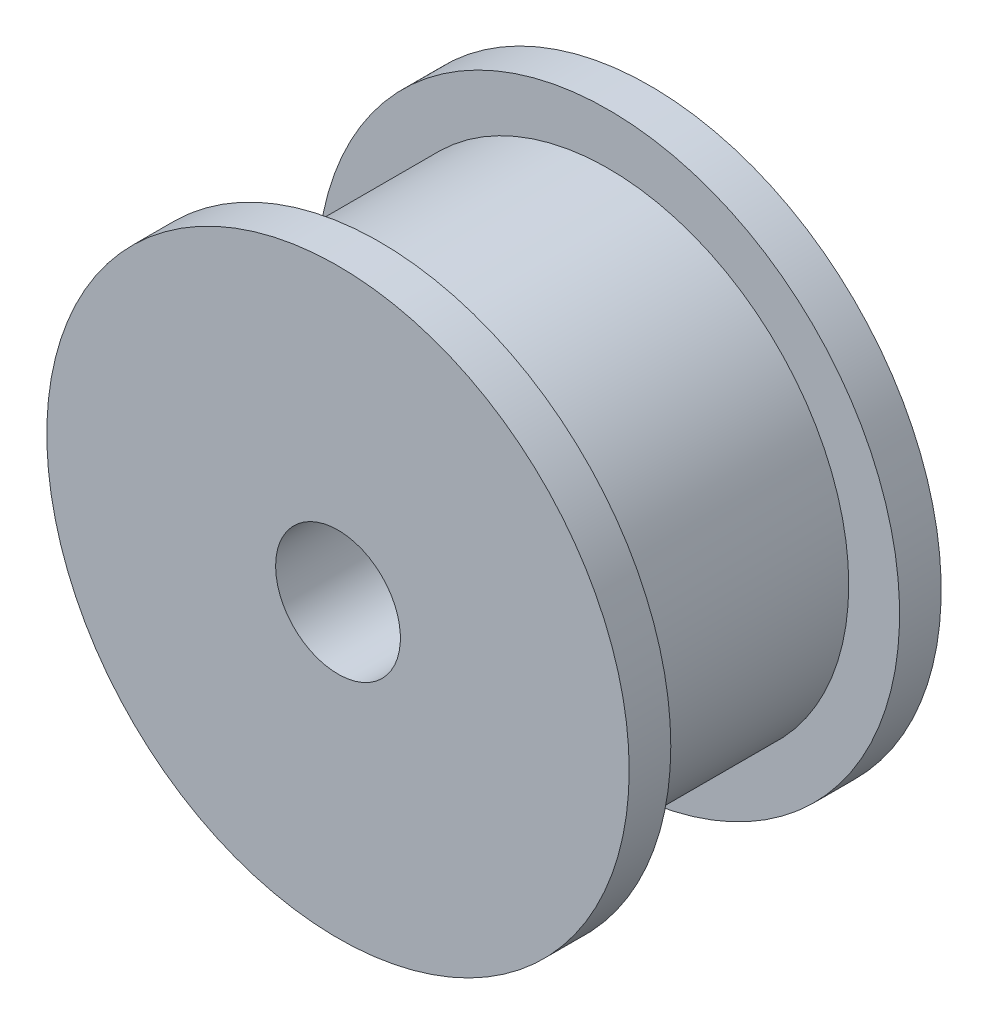
ISO-10303-21;
HEADER;
FILE_DESCRIPTION(('STEP AP214'),'2;1');
FILE_NAME('part.step','',(''),(''),'','','');
FILE_SCHEMA(('AUTOMOTIVE_DESIGN { 1 0 10303 214 1 1 1 1 }'));
ENDSEC;
DATA;
#1=APPLICATION_CONTEXT('core data for automotive mechanical design processes');
#2=APPLICATION_PROTOCOL_DEFINITION('international standard','automotive_design',2000,#1);
#3=PRODUCT_CONTEXT('',#1,'mechanical');
#4=PRODUCT('Part','Part','',(#3));
#5=PRODUCT_RELATED_PRODUCT_CATEGORY('part','',(#4));
#6=PRODUCT_DEFINITION_FORMATION('','',#4);
#7=PRODUCT_DEFINITION_CONTEXT('part definition',#1,'design');
#8=PRODUCT_DEFINITION('design','',#6,#7);
#9=PRODUCT_DEFINITION_SHAPE('','',#8);
#10=(LENGTH_UNIT() NAMED_UNIT(*) SI_UNIT(.MILLI.,.METRE.));
#11=(NAMED_UNIT(*) PLANE_ANGLE_UNIT() SI_UNIT($,.RADIAN.));
#12=(NAMED_UNIT(*) SI_UNIT($,.STERADIAN.) SOLID_ANGLE_UNIT());
#13=UNCERTAINTY_MEASURE_WITH_UNIT(LENGTH_MEASURE(1.E-05),#10,'distance_accuracy_value','');
#14=(GEOMETRIC_REPRESENTATION_CONTEXT(3) GLOBAL_UNCERTAINTY_ASSIGNED_CONTEXT((#13)) GLOBAL_UNIT_ASSIGNED_CONTEXT((#10,
#11,#12)) REPRESENTATION_CONTEXT('',''));
#15=CARTESIAN_POINT('',(0.,0.,0.));
#16=DIRECTION('',(0.,0.,1.));
#17=DIRECTION('',(1.,0.,0.));
#18=AXIS2_PLACEMENT_3D('',#15,#16,#17);
#19=CARTESIAN_POINT('',(0.,0.,11.));
#20=DIRECTION('',(0.,0.,-1.));
#21=DIRECTION('',(-1.,0.,0.));
#22=AXIS2_PLACEMENT_3D('',#19,#20,#21);
#23=CYLINDRICAL_SURFACE('',#22,11.555);
#24=CARTESIAN_POINT('',(0.,0.,11.));
#25=DIRECTION('',(0.,0.,1.));
#26=DIRECTION('',(1.,0.,0.));
#27=AXIS2_PLACEMENT_3D('',#24,#25,#26);
#28=CIRCLE('',#27,11.555);
#29=CARTESIAN_POINT('',(11.555,0.,11.));
#30=VERTEX_POINT('',#29);
#31=EDGE_CURVE('E10',#30,#30,#28,.T.);
#32=ORIENTED_EDGE('',*,*,#31,.F.);
#33=EDGE_LOOP('',(#32));
#34=FACE_BOUND('',#33,.T.);
#35=CARTESIAN_POINT('',(0.,0.,0.));
#36=DIRECTION('',(0.,0.,1.));
#37=DIRECTION('',(1.,0.,0.));
#38=AXIS2_PLACEMENT_3D('',#35,#36,#37);
#39=CIRCLE('',#38,11.555);
#40=CARTESIAN_POINT('',(11.555,0.,0.));
#41=VERTEX_POINT('',#40);
#42=EDGE_CURVE('E39',#41,#41,#39,.T.);
#43=ORIENTED_EDGE('',*,*,#42,.T.);
#44=EDGE_LOOP('',(#43));
#45=FACE_BOUND('',#44,.T.);
#46=ADVANCED_FACE('F36',(#34,#45),#23,.T.);
#47=CARTESIAN_POINT('',(0.,0.,13.));
#48=DIRECTION('',(0.,0.,-1.));
#49=DIRECTION('',(-1.,0.,0.));
#50=AXIS2_PLACEMENT_3D('',#47,#48,#49);
#51=CYLINDRICAL_SURFACE('',#50,14.);
#52=CARTESIAN_POINT('',(0.,0.,13.));
#53=DIRECTION('',(0.,0.,1.));
#54=DIRECTION('',(1.,0.,0.));
#55=AXIS2_PLACEMENT_3D('',#52,#53,#54);
#56=CIRCLE('',#55,14.);
#57=CARTESIAN_POINT('',(14.,0.,13.));
#58=VERTEX_POINT('',#57);
#59=EDGE_CURVE('E44',#58,#58,#56,.T.);
#60=ORIENTED_EDGE('',*,*,#59,.F.);
#61=EDGE_LOOP('',(#60));
#62=FACE_BOUND('',#61,.T.);
#63=CARTESIAN_POINT('',(0.,0.,11.));
#64=DIRECTION('',(0.,0.,1.));
#65=DIRECTION('',(1.,0.,0.));
#66=AXIS2_PLACEMENT_3D('',#63,#64,#65);
#67=CIRCLE('',#66,14.);
#68=CARTESIAN_POINT('',(14.,0.,11.));
#69=VERTEX_POINT('',#68);
#70=EDGE_CURVE('E50',#69,#69,#67,.T.);
#71=ORIENTED_EDGE('',*,*,#70,.T.);
#72=EDGE_LOOP('',(#71));
#73=FACE_BOUND('',#72,.T.);
#74=ADVANCED_FACE('F103',(#62,#73),#51,.T.);
#75=CARTESIAN_POINT('',(0.,0.,13.));
#76=DIRECTION('',(0.,0.,1.));
#77=DIRECTION('',(1.,0.,0.));
#78=AXIS2_PLACEMENT_3D('',#75,#76,#77);
#79=PLANE('',#78);
#80=CARTESIAN_POINT('',(0.,0.,13.));
#81=DIRECTION('',(0.,0.,-1.));
#82=DIRECTION('',(-1.,0.,0.));
#83=AXIS2_PLACEMENT_3D('',#80,#81,#82);
#84=CIRCLE('',#83,3.);
#85=CARTESIAN_POINT('',(-3.,0.,13.));
#86=VERTEX_POINT('',#85);
#87=EDGE_CURVE('E61',#86,#86,#84,.T.);
#88=ORIENTED_EDGE('',*,*,#87,.T.);
#89=EDGE_LOOP('',(#88));
#90=FACE_BOUND('',#89,.T.);
#91=ORIENTED_EDGE('',*,*,#59,.T.);
#92=EDGE_LOOP('',(#91));
#93=FACE_BOUND('',#92,.T.);
#94=ADVANCED_FACE('F73',(#90,#93),#79,.T.);
#95=CARTESIAN_POINT('',(0.,0.,11.));
#96=DIRECTION('',(0.,0.,1.));
#97=DIRECTION('',(1.,0.,0.));
#98=AXIS2_PLACEMENT_3D('',#95,#96,#97);
#99=PLANE('',#98);
#100=ORIENTED_EDGE('',*,*,#31,.T.);
#101=EDGE_LOOP('',(#100));
#102=FACE_BOUND('',#101,.T.);
#103=ORIENTED_EDGE('',*,*,#70,.F.);
#104=EDGE_LOOP('',(#103));
#105=FACE_BOUND('',#104,.T.);
#106=ADVANCED_FACE('F92',(#102,#105),#99,.F.);
#107=CARTESIAN_POINT('',(0.,0.,-2.));
#108=DIRECTION('',(0.,0.,1.));
#109=DIRECTION('',(1.,0.,0.));
#110=AXIS2_PLACEMENT_3D('',#107,#108,#109);
#111=CYLINDRICAL_SURFACE('',#110,14.);
#112=CARTESIAN_POINT('',(0.,0.,-2.));
#113=DIRECTION('',(0.,0.,-1.));
#114=DIRECTION('',(-1.,0.,0.));
#115=AXIS2_PLACEMENT_3D('',#112,#113,#114);
#116=CIRCLE('',#115,14.);
#117=CARTESIAN_POINT('',(-14.,0.,-2.));
#118=VERTEX_POINT('',#117);
#119=EDGE_CURVE('E60',#118,#118,#116,.T.);
#120=ORIENTED_EDGE('',*,*,#119,.F.);
#121=EDGE_LOOP('',(#120));
#122=FACE_BOUND('',#121,.T.);
#123=CARTESIAN_POINT('',(0.,0.,0.));
#124=DIRECTION('',(0.,0.,-1.));
#125=DIRECTION('',(-1.,0.,0.));
#126=AXIS2_PLACEMENT_3D('',#123,#124,#125);
#127=CIRCLE('',#126,14.);
#128=CARTESIAN_POINT('',(-14.,0.,0.));
#129=VERTEX_POINT('',#128);
#130=EDGE_CURVE('E56',#129,#129,#127,.T.);
#131=ORIENTED_EDGE('',*,*,#130,.T.);
#132=EDGE_LOOP('',(#131));
#133=FACE_BOUND('',#132,.T.);
#134=ADVANCED_FACE('F86',(#122,#133),#111,.T.);
#135=CARTESIAN_POINT('',(0.,0.,-2.));
#136=DIRECTION('',(0.,0.,-1.));
#137=DIRECTION('',(-1.,0.,0.));
#138=AXIS2_PLACEMENT_3D('',#135,#136,#137);
#139=PLANE('',#138);
#140=CARTESIAN_POINT('',(0.,0.,-2.));
#141=DIRECTION('',(0.,0.,-1.));
#142=DIRECTION('',(-1.,0.,0.));
#143=AXIS2_PLACEMENT_3D('',#140,#141,#142);
#144=CIRCLE('',#143,3.);
#145=CARTESIAN_POINT('',(-3.,0.,-2.));
#146=VERTEX_POINT('',#145);
#147=EDGE_CURVE('E65',#146,#146,#144,.T.);
#148=ORIENTED_EDGE('',*,*,#147,.F.);
#149=EDGE_LOOP('',(#148));
#150=FACE_BOUND('',#149,.T.);
#151=ORIENTED_EDGE('',*,*,#119,.T.);
#152=EDGE_LOOP('',(#151));
#153=FACE_BOUND('',#152,.T.);
#154=ADVANCED_FACE('F83',(#150,#153),#139,.T.);
#155=CARTESIAN_POINT('',(0.,0.,0.));
#156=DIRECTION('',(0.,0.,-1.));
#157=DIRECTION('',(-1.,0.,0.));
#158=AXIS2_PLACEMENT_3D('',#155,#156,#157);
#159=PLANE('',#158);
#160=ORIENTED_EDGE('',*,*,#42,.F.);
#161=EDGE_LOOP('',(#160));
#162=FACE_BOUND('',#161,.T.);
#163=ORIENTED_EDGE('',*,*,#130,.F.);
#164=EDGE_LOOP('',(#163));
#165=FACE_BOUND('',#164,.T.);
#166=ADVANCED_FACE('F79',(#162,#165),#159,.F.);
#167=CARTESIAN_POINT('',(0.,0.,13.));
#168=DIRECTION('',(0.,0.,-1.));
#169=DIRECTION('',(-1.,0.,0.));
#170=AXIS2_PLACEMENT_3D('',#167,#168,#169);
#171=CYLINDRICAL_SURFACE('',#170,3.);
#172=ORIENTED_EDGE('',*,*,#87,.F.);
#173=EDGE_LOOP('',(#172));
#174=FACE_BOUND('',#173,.T.);
#175=ORIENTED_EDGE('',*,*,#147,.T.);
#176=EDGE_LOOP('',(#175));
#177=FACE_BOUND('',#176,.T.);
#178=ADVANCED_FACE('F76',(#174,#177),#171,.F.);
#179=CLOSED_SHELL('',(#46,#74,#94,#106,#134,#154,#166,#178));
#180=MANIFOLD_SOLID_BREP('B2',#179);
#181=ADVANCED_BREP_SHAPE_REPRESENTATION('',(#18,#180),#14);
#182=SHAPE_DEFINITION_REPRESENTATION(#9,#181);
ENDSEC;
END-ISO-10303-21;
